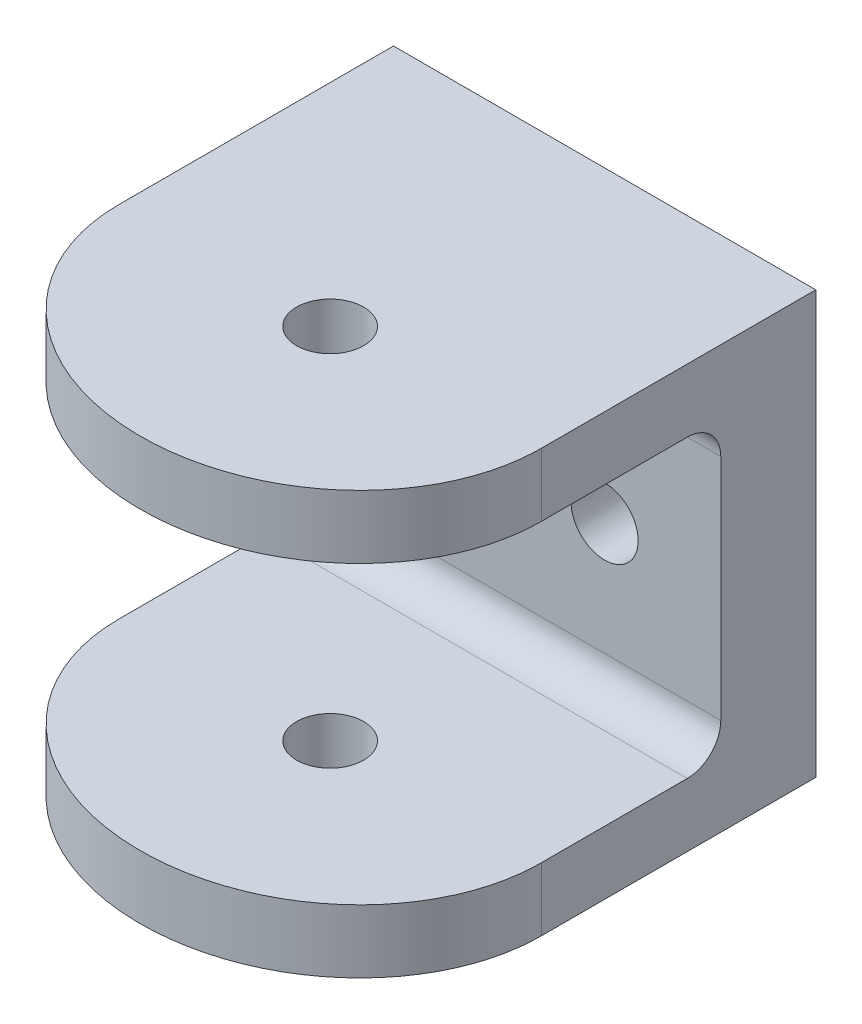
ISO-10303-21;
HEADER;
FILE_DESCRIPTION(('STEP AP214'),'2;1');
FILE_NAME('part.step','',(''),(''),'','','');
FILE_SCHEMA(('AUTOMOTIVE_DESIGN { 1 0 10303 214 1 1 1 1 }'));
ENDSEC;
DATA;
#1=APPLICATION_CONTEXT('core data for automotive mechanical design processes');
#2=APPLICATION_PROTOCOL_DEFINITION('international standard','automotive_design',2000,#1);
#3=PRODUCT_CONTEXT('',#1,'mechanical');
#4=PRODUCT('Part','Part','',(#3));
#5=PRODUCT_RELATED_PRODUCT_CATEGORY('part','',(#4));
#6=PRODUCT_DEFINITION_FORMATION('','',#4);
#7=PRODUCT_DEFINITION_CONTEXT('part definition',#1,'design');
#8=PRODUCT_DEFINITION('design','',#6,#7);
#9=PRODUCT_DEFINITION_SHAPE('','',#8);
#10=(LENGTH_UNIT() NAMED_UNIT(*) SI_UNIT(.MILLI.,.METRE.));
#11=(NAMED_UNIT(*) PLANE_ANGLE_UNIT() SI_UNIT($,.RADIAN.));
#12=(NAMED_UNIT(*) SI_UNIT($,.STERADIAN.) SOLID_ANGLE_UNIT());
#13=UNCERTAINTY_MEASURE_WITH_UNIT(LENGTH_MEASURE(1.E-05),#10,'distance_accuracy_value','');
#14=(GEOMETRIC_REPRESENTATION_CONTEXT(3) GLOBAL_UNCERTAINTY_ASSIGNED_CONTEXT((#13)) GLOBAL_UNIT_ASSIGNED_CONTEXT((#10,
#11,#12)) REPRESENTATION_CONTEXT('',''));
#15=CARTESIAN_POINT('',(0.,0.,0.));
#16=DIRECTION('',(0.,0.,1.));
#17=DIRECTION('',(1.,0.,0.));
#18=AXIS2_PLACEMENT_3D('',#15,#16,#17);
#19=CARTESIAN_POINT('',(-20.,20.,9.));
#20=DIRECTION('',(0.,-1.,0.));
#21=DIRECTION('',(0.,0.,-1.));
#22=AXIS2_PLACEMENT_3D('',#19,#20,#21);
#23=PLANE('',#22);
#24=CARTESIAN_POINT('',(0.,20.,26.));
#25=DIRECTION('',(0.,1.,0.));
#26=DIRECTION('',(0.,0.,1.));
#27=AXIS2_PLACEMENT_3D('',#24,#25,#26);
#28=CIRCLE('',#27,3.175);
#29=CARTESIAN_POINT('',(0.,20.,29.175));
#30=VERTEX_POINT('',#29);
#31=EDGE_CURVE('E315',#30,#30,#28,.T.);
#32=ORIENTED_EDGE('',*,*,#31,.F.);
#33=EDGE_LOOP('',(#32));
#34=FACE_BOUND('',#33,.T.);
#35=CARTESIAN_POINT('',(0.,20.,26.));
#36=DIRECTION('',(0.,1.,0.));
#37=DIRECTION('',(1.,0.,0.));
#38=AXIS2_PLACEMENT_3D('',#35,#36,#37);
#39=ELLIPSE('',#38,20.,18.);
#40=CARTESIAN_POINT('',(-20.,20.,26.));
#41=VERTEX_POINT('',#40);
#42=CARTESIAN_POINT('',(20.,20.,26.));
#43=VERTEX_POINT('',#42);
#44=EDGE_CURVE('E183',#41,#43,#39,.T.);
#45=ORIENTED_EDGE('',*,*,#44,.T.);
#46=DIRECTION('',(0.,0.,-1.));
#47=VECTOR('',#46,1.);
#48=CARTESIAN_POINT('',(20.,20.,9.));
#49=LINE('',#48,#47);
#50=CARTESIAN_POINT('',(20.,20.,0.));
#51=VERTEX_POINT('',#50);
#52=EDGE_CURVE('E213',#43,#51,#49,.T.);
#53=ORIENTED_EDGE('',*,*,#52,.T.);
#54=DIRECTION('',(-1.,0.,0.));
#55=VECTOR('',#54,1.);
#56=CARTESIAN_POINT('',(-20.,20.,0.));
#57=LINE('',#56,#55);
#58=CARTESIAN_POINT('',(-20.,20.,0.));
#59=VERTEX_POINT('',#58);
#60=EDGE_CURVE('E292',#51,#59,#57,.T.);
#61=ORIENTED_EDGE('',*,*,#60,.T.);
#62=DIRECTION('',(0.,0.,-1.));
#63=VECTOR('',#62,1.);
#64=CARTESIAN_POINT('',(-20.,20.,9.));
#65=LINE('',#64,#63);
#66=EDGE_CURVE('E204',#41,#59,#65,.T.);
#67=ORIENTED_EDGE('',*,*,#66,.F.);
#68=EDGE_LOOP('',(#45,#53,#61,#67));
#69=FACE_BOUND('',#68,.T.);
#70=ADVANCED_FACE('F92',(#34,#69),#23,.F.);
#71=CARTESIAN_POINT('',(-20.,-20.,9.));
#72=DIRECTION('',(0.,1.,0.));
#73=DIRECTION('',(0.,0.,1.));
#74=AXIS2_PLACEMENT_3D('',#71,#72,#73);
#75=PLANE('',#74);
#76=CARTESIAN_POINT('',(0.,-20.,26.));
#77=DIRECTION('',(0.,1.,0.));
#78=DIRECTION('',(0.,0.,1.));
#79=AXIS2_PLACEMENT_3D('',#76,#77,#78);
#80=CIRCLE('',#79,3.175);
#81=CARTESIAN_POINT('',(0.,-20.,29.175));
#82=VERTEX_POINT('',#81);
#83=EDGE_CURVE('E312',#82,#82,#80,.T.);
#84=ORIENTED_EDGE('',*,*,#83,.T.);
#85=EDGE_LOOP('',(#84));
#86=FACE_BOUND('',#85,.T.);
#87=DIRECTION('',(0.,0.,-1.));
#88=VECTOR('',#87,1.);
#89=CARTESIAN_POINT('',(20.,-20.,9.));
#90=LINE('',#89,#88);
#91=CARTESIAN_POINT('',(20.,-20.,26.));
#92=VERTEX_POINT('',#91);
#93=CARTESIAN_POINT('',(20.,-20.,0.));
#94=VERTEX_POINT('',#93);
#95=EDGE_CURVE('E188',#92,#94,#90,.T.);
#96=ORIENTED_EDGE('',*,*,#95,.F.);
#97=CARTESIAN_POINT('',(0.,-20.,26.));
#98=DIRECTION('',(0.,1.,0.));
#99=DIRECTION('',(1.,0.,0.));
#100=AXIS2_PLACEMENT_3D('',#97,#98,#99);
#101=ELLIPSE('',#100,20.,18.);
#102=CARTESIAN_POINT('',(-20.,-20.,26.));
#103=VERTEX_POINT('',#102);
#104=EDGE_CURVE('E173',#103,#92,#101,.T.);
#105=ORIENTED_EDGE('',*,*,#104,.F.);
#106=DIRECTION('',(0.,0.,-1.));
#107=VECTOR('',#106,1.);
#108=CARTESIAN_POINT('',(-20.,-20.,9.));
#109=LINE('',#108,#107);
#110=CARTESIAN_POINT('',(-20.,-20.,0.));
#111=VERTEX_POINT('',#110);
#112=EDGE_CURVE('E199',#103,#111,#109,.T.);
#113=ORIENTED_EDGE('',*,*,#112,.T.);
#114=DIRECTION('',(1.,0.,0.));
#115=VECTOR('',#114,1.);
#116=CARTESIAN_POINT('',(-20.,-20.,0.));
#117=LINE('',#116,#115);
#118=EDGE_CURVE('E196',#111,#94,#117,.T.);
#119=ORIENTED_EDGE('',*,*,#118,.T.);
#120=EDGE_LOOP('',(#96,#105,#113,#119));
#121=FACE_BOUND('',#120,.T.);
#122=ADVANCED_FACE('F194',(#86,#121),#75,.F.);
#123=CARTESIAN_POINT('',(20.,-14.,44.));
#124=DIRECTION('',(0.,-1.,0.));
#125=DIRECTION('',(1.,0.,0.));
#126=AXIS2_PLACEMENT_3D('',#123,#124,#125);
#127=PLANE('',#126);
#128=CARTESIAN_POINT('',(0.,-14.,26.));
#129=DIRECTION('',(0.,-1.,0.));
#130=DIRECTION('',(1.,0.,0.));
#131=AXIS2_PLACEMENT_3D('',#128,#129,#130);
#132=CIRCLE('',#131,3.175);
#133=CARTESIAN_POINT('',(3.175,-14.,26.));
#134=VERTEX_POINT('',#133);
#135=EDGE_CURVE('E242',#134,#134,#132,.T.);
#136=ORIENTED_EDGE('',*,*,#135,.T.);
#137=EDGE_LOOP('',(#136));
#138=FACE_BOUND('',#137,.T.);
#139=CARTESIAN_POINT('',(0.,-14.,26.));
#140=DIRECTION('',(0.,1.,0.));
#141=DIRECTION('',(1.,0.,0.));
#142=AXIS2_PLACEMENT_3D('',#139,#140,#141);
#143=ELLIPSE('',#142,20.,18.);
#144=CARTESIAN_POINT('',(20.,-14.,26.));
#145=VERTEX_POINT('',#144);
#146=CARTESIAN_POINT('',(-20.,-14.,26.));
#147=VERTEX_POINT('',#146);
#148=EDGE_CURVE('E243',#145,#147,#143,.F.);
#149=ORIENTED_EDGE('',*,*,#148,.F.);
#150=DIRECTION('',(0.,0.,-1.));
#151=VECTOR('',#150,1.);
#152=CARTESIAN_POINT('',(20.,-14.,44.));
#153=LINE('',#152,#151);
#154=CARTESIAN_POINT('',(20.,-14.,12.175));
#155=VERTEX_POINT('',#154);
#156=EDGE_CURVE('E110',#145,#155,#153,.T.);
#157=ORIENTED_EDGE('',*,*,#156,.T.);
#158=DIRECTION('',(-1.,0.,0.));
#159=VECTOR('',#158,1.);
#160=CARTESIAN_POINT('',(-20.,-14.,12.175));
#161=LINE('',#160,#159);
#162=CARTESIAN_POINT('',(-20.,-14.,12.175));
#163=VERTEX_POINT('',#162);
#164=EDGE_CURVE('E227',#155,#163,#161,.T.);
#165=ORIENTED_EDGE('',*,*,#164,.T.);
#166=DIRECTION('',(0.,0.,-1.));
#167=VECTOR('',#166,1.);
#168=CARTESIAN_POINT('',(-20.,-14.,44.));
#169=LINE('',#168,#167);
#170=EDGE_CURVE('E117',#147,#163,#169,.T.);
#171=ORIENTED_EDGE('',*,*,#170,.F.);
#172=EDGE_LOOP('',(#149,#157,#165,#171));
#173=FACE_BOUND('',#172,.T.);
#174=ADVANCED_FACE('F331',(#138,#173),#127,.F.);
#175=CARTESIAN_POINT('',(-20.,14.,44.));
#176=DIRECTION('',(0.,1.,0.));
#177=DIRECTION('',(0.,0.,1.));
#178=AXIS2_PLACEMENT_3D('',#175,#176,#177);
#179=PLANE('',#178);
#180=CARTESIAN_POINT('',(0.,14.,26.));
#181=DIRECTION('',(0.,1.,0.));
#182=DIRECTION('',(0.,0.,1.));
#183=AXIS2_PLACEMENT_3D('',#180,#181,#182);
#184=CIRCLE('',#183,3.175);
#185=CARTESIAN_POINT('',(0.,14.,29.175));
#186=VERTEX_POINT('',#185);
#187=EDGE_CURVE('E191',#186,#186,#184,.T.);
#188=ORIENTED_EDGE('',*,*,#187,.T.);
#189=EDGE_LOOP('',(#188));
#190=FACE_BOUND('',#189,.T.);
#191=DIRECTION('',(0.,0.,-1.));
#192=VECTOR('',#191,1.);
#193=CARTESIAN_POINT('',(20.,14.,44.));
#194=LINE('',#193,#192);
#195=CARTESIAN_POINT('',(20.,14.,26.));
#196=VERTEX_POINT('',#195);
#197=CARTESIAN_POINT('',(20.,14.,12.175));
#198=VERTEX_POINT('',#197);
#199=EDGE_CURVE('E262',#196,#198,#194,.T.);
#200=ORIENTED_EDGE('',*,*,#199,.F.);
#201=CARTESIAN_POINT('',(0.,14.,26.));
#202=DIRECTION('',(0.,1.,0.));
#203=DIRECTION('',(1.,0.,0.));
#204=AXIS2_PLACEMENT_3D('',#201,#202,#203);
#205=ELLIPSE('',#204,20.,18.);
#206=CARTESIAN_POINT('',(-20.,14.,26.));
#207=VERTEX_POINT('',#206);
#208=EDGE_CURVE('E247',#207,#196,#205,.T.);
#209=ORIENTED_EDGE('',*,*,#208,.F.);
#210=DIRECTION('',(0.,0.,-1.));
#211=VECTOR('',#210,1.);
#212=CARTESIAN_POINT('',(-20.,14.,44.));
#213=LINE('',#212,#211);
#214=CARTESIAN_POINT('',(-20.,14.,12.175));
#215=VERTEX_POINT('',#214);
#216=EDGE_CURVE('E246',#207,#215,#213,.T.);
#217=ORIENTED_EDGE('',*,*,#216,.T.);
#218=DIRECTION('',(1.,0.,0.));
#219=VECTOR('',#218,1.);
#220=CARTESIAN_POINT('',(20.,14.,12.175));
#221=LINE('',#220,#219);
#222=EDGE_CURVE('E217',#215,#198,#221,.T.);
#223=ORIENTED_EDGE('',*,*,#222,.T.);
#224=EDGE_LOOP('',(#200,#209,#217,#223));
#225=FACE_BOUND('',#224,.T.);
#226=ADVANCED_FACE('F328',(#190,#225),#179,.F.);
#227=CARTESIAN_POINT('',(20.,-20.,9.));
#228=DIRECTION('',(-1.,0.,0.));
#229=DIRECTION('',(0.,-1.,0.));
#230=AXIS2_PLACEMENT_3D('',#227,#228,#229);
#231=PLANE('',#230);
#232=DIRECTION('',(0.,1.,0.));
#233=VECTOR('',#232,1.);
#234=CARTESIAN_POINT('',(20.,-20.,26.));
#235=LINE('',#234,#233);
#236=EDGE_CURVE('E176',#92,#145,#235,.T.);
#237=ORIENTED_EDGE('',*,*,#236,.F.);
#238=ORIENTED_EDGE('',*,*,#95,.T.);
#239=DIRECTION('',(0.,1.,0.));
#240=VECTOR('',#239,1.);
#241=CARTESIAN_POINT('',(20.,-20.,0.));
#242=LINE('',#241,#240);
#243=EDGE_CURVE('E282',#94,#51,#242,.T.);
#244=ORIENTED_EDGE('',*,*,#243,.T.);
#245=ORIENTED_EDGE('',*,*,#52,.F.);
#246=EDGE_CURVE('E192',#196,#43,#235,.T.);
#247=ORIENTED_EDGE('',*,*,#246,.F.);
#248=ORIENTED_EDGE('',*,*,#199,.T.);
#249=CARTESIAN_POINT('',(20.,10.825,12.175));
#250=DIRECTION('',(-1.,0.,0.));
#251=DIRECTION('',(0.,-1.,0.));
#252=AXIS2_PLACEMENT_3D('',#249,#250,#251);
#253=CIRCLE('',#252,3.175);
#254=CARTESIAN_POINT('',(20.,10.825,9.));
#255=VERTEX_POINT('',#254);
#256=EDGE_CURVE('E230',#198,#255,#253,.T.);
#257=ORIENTED_EDGE('',*,*,#256,.T.);
#258=DIRECTION('',(0.,1.,0.));
#259=VECTOR('',#258,1.);
#260=CARTESIAN_POINT('',(20.,-20.,9.));
#261=LINE('',#260,#259);
#262=CARTESIAN_POINT('',(20.,-10.825,9.));
#263=VERTEX_POINT('',#262);
#264=EDGE_CURVE('E207',#263,#255,#261,.T.);
#265=ORIENTED_EDGE('',*,*,#264,.F.);
#266=CARTESIAN_POINT('',(20.,-10.825,12.175));
#267=DIRECTION('',(-1.,0.,0.));
#268=DIRECTION('',(0.,-1.,0.));
#269=AXIS2_PLACEMENT_3D('',#266,#267,#268);
#270=CIRCLE('',#269,3.175);
#271=EDGE_CURVE('E13',#263,#155,#270,.T.);
#272=ORIENTED_EDGE('',*,*,#271,.T.);
#273=ORIENTED_EDGE('',*,*,#156,.F.);
#274=EDGE_LOOP('',(#237,#238,#244,#245,#247,#248,#257,#265,#272,#273));
#275=FACE_BOUND('',#274,.T.);
#276=ADVANCED_FACE('F186',(#275),#231,.F.);
#277=CARTESIAN_POINT('',(0.,0.,9.));
#278=DIRECTION('',(0.,0.,-1.));
#279=DIRECTION('',(-1.,0.,0.));
#280=AXIS2_PLACEMENT_3D('',#277,#278,#279);
#281=PLANE('',#280);
#282=CARTESIAN_POINT('',(9.,0.,9.));
#283=DIRECTION('',(0.,0.,1.));
#284=DIRECTION('',(1.,0.,0.));
#285=AXIS2_PLACEMENT_3D('',#282,#283,#284);
#286=CIRCLE('',#285,3.175);
#287=CARTESIAN_POINT('',(12.175,0.,9.));
#288=VERTEX_POINT('',#287);
#289=EDGE_CURVE('E278',#288,#288,#286,.T.);
#290=ORIENTED_EDGE('',*,*,#289,.F.);
#291=EDGE_LOOP('',(#290));
#292=FACE_BOUND('',#291,.T.);
#293=CARTESIAN_POINT('',(-9.,0.,9.));
#294=DIRECTION('',(0.,0.,1.));
#295=DIRECTION('',(1.,0.,0.));
#296=AXIS2_PLACEMENT_3D('',#293,#294,#295);
#297=CIRCLE('',#296,3.175);
#298=CARTESIAN_POINT('',(-5.825,0.,9.));
#299=VERTEX_POINT('',#298);
#300=EDGE_CURVE('E270',#299,#299,#297,.T.);
#301=ORIENTED_EDGE('',*,*,#300,.F.);
#302=EDGE_LOOP('',(#301));
#303=FACE_BOUND('',#302,.T.);
#304=ORIENTED_EDGE('',*,*,#264,.T.);
#305=DIRECTION('',(1.,0.,0.));
#306=VECTOR('',#305,1.);
#307=CARTESIAN_POINT('',(-20.,10.825,9.));
#308=LINE('',#307,#306);
#309=CARTESIAN_POINT('',(-20.,10.825,9.));
#310=VERTEX_POINT('',#309);
#311=EDGE_CURVE('E224',#255,#310,#308,.F.);
#312=ORIENTED_EDGE('',*,*,#311,.T.);
#313=DIRECTION('',(0.,-1.,0.));
#314=VECTOR('',#313,1.);
#315=CARTESIAN_POINT('',(-20.,-20.,9.));
#316=LINE('',#315,#314);
#317=CARTESIAN_POINT('',(-20.,-10.825,9.));
#318=VERTEX_POINT('',#317);
#319=EDGE_CURVE('E200',#310,#318,#316,.T.);
#320=ORIENTED_EDGE('',*,*,#319,.T.);
#321=DIRECTION('',(-1.,0.,0.));
#322=VECTOR('',#321,1.);
#323=CARTESIAN_POINT('',(20.,-10.825,9.));
#324=LINE('',#323,#322);
#325=EDGE_CURVE('E221',#318,#263,#324,.F.);
#326=ORIENTED_EDGE('',*,*,#325,.T.);
#327=EDGE_LOOP('',(#304,#312,#320,#326));
#328=FACE_BOUND('',#327,.T.);
#329=ADVANCED_FACE('F345',(#292,#303,#328),#281,.F.);
#330=CARTESIAN_POINT('',(0.,0.,0.));
#331=DIRECTION('',(0.,0.,-1.));
#332=DIRECTION('',(-1.,0.,0.));
#333=AXIS2_PLACEMENT_3D('',#330,#331,#332);
#334=PLANE('',#333);
#335=CARTESIAN_POINT('',(9.,0.,0.));
#336=DIRECTION('',(0.,0.,1.));
#337=DIRECTION('',(1.,0.,0.));
#338=AXIS2_PLACEMENT_3D('',#335,#336,#337);
#339=CIRCLE('',#338,3.175);
#340=CARTESIAN_POINT('',(12.175,0.,0.));
#341=VERTEX_POINT('',#340);
#342=EDGE_CURVE('E274',#341,#341,#339,.T.);
#343=ORIENTED_EDGE('',*,*,#342,.T.);
#344=EDGE_LOOP('',(#343));
#345=FACE_BOUND('',#344,.T.);
#346=ORIENTED_EDGE('',*,*,#243,.F.);
#347=ORIENTED_EDGE('',*,*,#118,.F.);
#348=DIRECTION('',(0.,-1.,0.));
#349=VECTOR('',#348,1.);
#350=CARTESIAN_POINT('',(-20.,-20.,0.));
#351=LINE('',#350,#349);
#352=EDGE_CURVE('E295',#59,#111,#351,.T.);
#353=ORIENTED_EDGE('',*,*,#352,.F.);
#354=ORIENTED_EDGE('',*,*,#60,.F.);
#355=EDGE_LOOP('',(#346,#347,#353,#354));
#356=FACE_BOUND('',#355,.T.);
#357=CARTESIAN_POINT('',(-9.,0.,0.));
#358=DIRECTION('',(0.,0.,1.));
#359=DIRECTION('',(1.,0.,0.));
#360=AXIS2_PLACEMENT_3D('',#357,#358,#359);
#361=CIRCLE('',#360,3.175);
#362=CARTESIAN_POINT('',(-5.825,0.,0.));
#363=VERTEX_POINT('',#362);
#364=EDGE_CURVE('E269',#363,#363,#361,.T.);
#365=ORIENTED_EDGE('',*,*,#364,.T.);
#366=EDGE_LOOP('',(#365));
#367=FACE_BOUND('',#366,.T.);
#368=ADVANCED_FACE('F304',(#345,#356,#367),#334,.T.);
#369=CARTESIAN_POINT('',(-20.,-20.,9.));
#370=DIRECTION('',(1.,0.,0.));
#371=DIRECTION('',(0.,0.,-1.));
#372=AXIS2_PLACEMENT_3D('',#369,#370,#371);
#373=PLANE('',#372);
#374=ORIENTED_EDGE('',*,*,#112,.F.);
#375=DIRECTION('',(0.,1.,0.));
#376=VECTOR('',#375,1.);
#377=CARTESIAN_POINT('',(-20.,-20.,26.));
#378=LINE('',#377,#376);
#379=EDGE_CURVE('E177',#103,#147,#378,.T.);
#380=ORIENTED_EDGE('',*,*,#379,.T.);
#381=ORIENTED_EDGE('',*,*,#170,.T.);
#382=CARTESIAN_POINT('',(-20.,-10.825,12.175));
#383=DIRECTION('',(1.,0.,0.));
#384=DIRECTION('',(0.,0.,-1.));
#385=AXIS2_PLACEMENT_3D('',#382,#383,#384);
#386=CIRCLE('',#385,3.175);
#387=EDGE_CURVE('E102',#163,#318,#386,.T.);
#388=ORIENTED_EDGE('',*,*,#387,.T.);
#389=ORIENTED_EDGE('',*,*,#319,.F.);
#390=CARTESIAN_POINT('',(-20.,10.825,12.175));
#391=DIRECTION('',(1.,0.,0.));
#392=DIRECTION('',(0.,0.,-1.));
#393=AXIS2_PLACEMENT_3D('',#390,#391,#392);
#394=CIRCLE('',#393,3.175);
#395=EDGE_CURVE('E233',#310,#215,#394,.T.);
#396=ORIENTED_EDGE('',*,*,#395,.T.);
#397=ORIENTED_EDGE('',*,*,#216,.F.);
#398=EDGE_CURVE('E182',#207,#41,#378,.T.);
#399=ORIENTED_EDGE('',*,*,#398,.T.);
#400=ORIENTED_EDGE('',*,*,#66,.T.);
#401=ORIENTED_EDGE('',*,*,#352,.T.);
#402=EDGE_LOOP('',(#374,#380,#381,#388,#389,#396,#397,#399,#400,#401));
#403=FACE_BOUND('',#402,.T.);
#404=ADVANCED_FACE('F300',(#403),#373,.F.);
#405=CARTESIAN_POINT('',(9.,0.,9.));
#406=DIRECTION('',(0.,0.,-1.));
#407=DIRECTION('',(-1.,0.,0.));
#408=AXIS2_PLACEMENT_3D('',#405,#406,#407);
#409=CYLINDRICAL_SURFACE('',#408,3.175);
#410=ORIENTED_EDGE('',*,*,#289,.T.);
#411=EDGE_LOOP('',(#410));
#412=FACE_BOUND('',#411,.T.);
#413=ORIENTED_EDGE('',*,*,#342,.F.);
#414=EDGE_LOOP('',(#413));
#415=FACE_BOUND('',#414,.T.);
#416=ADVANCED_FACE('F340',(#412,#415),#409,.F.);
#417=CARTESIAN_POINT('',(-9.,0.,9.));
#418=DIRECTION('',(0.,0.,-1.));
#419=DIRECTION('',(-1.,0.,0.));
#420=AXIS2_PLACEMENT_3D('',#417,#418,#419);
#421=CYLINDRICAL_SURFACE('',#420,3.175);
#422=ORIENTED_EDGE('',*,*,#300,.T.);
#423=EDGE_LOOP('',(#422));
#424=FACE_BOUND('',#423,.T.);
#425=ORIENTED_EDGE('',*,*,#364,.F.);
#426=EDGE_LOOP('',(#425));
#427=FACE_BOUND('',#426,.T.);
#428=ADVANCED_FACE('F336',(#424,#427),#421,.F.);
#429=CARTESIAN_POINT('',(-20.,10.825,12.175));
#430=DIRECTION('',(-1.,0.,0.));
#431=DIRECTION('',(0.,0.,1.));
#432=AXIS2_PLACEMENT_3D('',#429,#430,#431);
#433=CYLINDRICAL_SURFACE('',#432,3.175);
#434=ORIENTED_EDGE('',*,*,#395,.F.);
#435=ORIENTED_EDGE('',*,*,#311,.F.);
#436=ORIENTED_EDGE('',*,*,#256,.F.);
#437=ORIENTED_EDGE('',*,*,#222,.F.);
#438=EDGE_LOOP('',(#434,#435,#436,#437));
#439=FACE_BOUND('',#438,.T.);
#440=ADVANCED_FACE('F339',(#439),#433,.F.);
#441=CARTESIAN_POINT('',(20.,-10.825,12.175));
#442=DIRECTION('',(1.,0.,0.));
#443=DIRECTION('',(0.,1.,0.));
#444=AXIS2_PLACEMENT_3D('',#441,#442,#443);
#445=CYLINDRICAL_SURFACE('',#444,3.175);
#446=ORIENTED_EDGE('',*,*,#271,.F.);
#447=ORIENTED_EDGE('',*,*,#325,.F.);
#448=ORIENTED_EDGE('',*,*,#387,.F.);
#449=ORIENTED_EDGE('',*,*,#164,.F.);
#450=EDGE_LOOP('',(#446,#447,#448,#449));
#451=FACE_BOUND('',#450,.T.);
#452=ADVANCED_FACE('F94',(#451),#445,.F.);
#453=DIRECTION('',(0.,1.,0.));
#454=VECTOR('',#453,1.);
#455=SURFACE_OF_LINEAR_EXTRUSION('',#101,#454);
#456=ORIENTED_EDGE('',*,*,#208,.T.);
#457=ORIENTED_EDGE('',*,*,#246,.T.);
#458=ORIENTED_EDGE('',*,*,#44,.F.);
#459=ORIENTED_EDGE('',*,*,#398,.F.);
#460=EDGE_LOOP('',(#456,#457,#458,#459));
#461=FACE_BOUND('',#460,.T.);
#462=ADVANCED_FACE('F310',(#461),#455,.T.);
#463=ORIENTED_EDGE('',*,*,#148,.T.);
#464=ORIENTED_EDGE('',*,*,#379,.F.);
#465=ORIENTED_EDGE('',*,*,#104,.T.);
#466=ORIENTED_EDGE('',*,*,#236,.T.);
#467=EDGE_LOOP('',(#463,#464,#465,#466));
#468=FACE_BOUND('',#467,.T.);
#469=ADVANCED_FACE('F175',(#468),#455,.T.);
#470=CARTESIAN_POINT('',(0.,-20.,26.));
#471=DIRECTION('',(0.,1.,0.));
#472=DIRECTION('',(0.,0.,1.));
#473=AXIS2_PLACEMENT_3D('',#470,#471,#472);
#474=CYLINDRICAL_SURFACE('',#473,3.175);
#475=ORIENTED_EDGE('',*,*,#31,.T.);
#476=EDGE_LOOP('',(#475));
#477=FACE_BOUND('',#476,.T.);
#478=ORIENTED_EDGE('',*,*,#187,.F.);
#479=EDGE_LOOP('',(#478));
#480=FACE_BOUND('',#479,.T.);
#481=ADVANCED_FACE('F326',(#477,#480),#474,.F.);
#482=ORIENTED_EDGE('',*,*,#83,.F.);
#483=EDGE_LOOP('',(#482));
#484=FACE_BOUND('',#483,.T.);
#485=ORIENTED_EDGE('',*,*,#135,.F.);
#486=EDGE_LOOP('',(#485));
#487=FACE_BOUND('',#486,.T.);
#488=ADVANCED_FACE('F327',(#484,#487),#474,.F.);
#489=CLOSED_SHELL('',(#70,#122,#174,#226,#276,#329,#368,#404,#416,#428,#440,#452,#462,#469,#481,#488));
#490=MANIFOLD_SOLID_BREP('B2',#489);
#491=ADVANCED_BREP_SHAPE_REPRESENTATION('',(#18,#490),#14);
#492=SHAPE_DEFINITION_REPRESENTATION(#9,#491);
ENDSEC;
END-ISO-10303-21;
